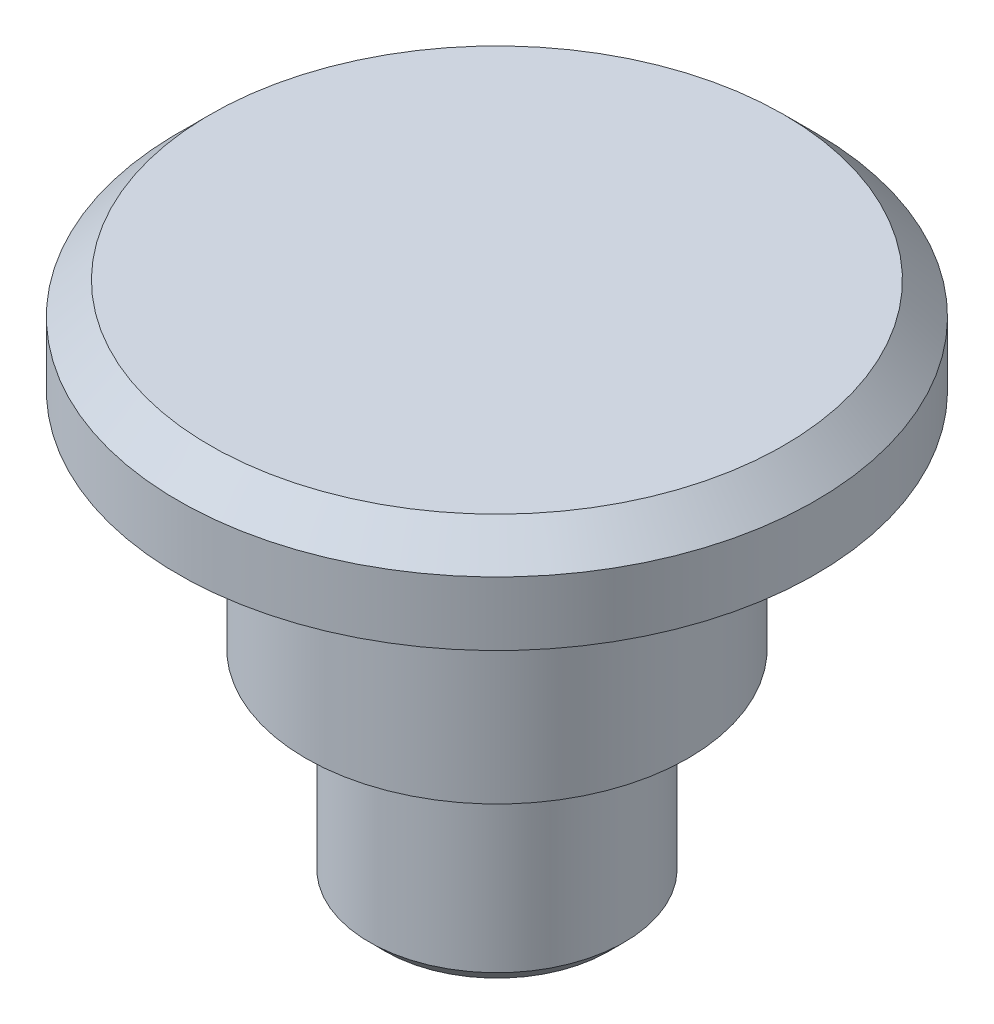
ISO-10303-21;
HEADER;
FILE_DESCRIPTION(('STEP AP214'),'2;1');
FILE_NAME('part.step','',(''),(''),'','','');
FILE_SCHEMA(('AUTOMOTIVE_DESIGN { 1 0 10303 214 1 1 1 1 }'));
ENDSEC;
DATA;
#1=APPLICATION_CONTEXT('core data for automotive mechanical design processes');
#2=APPLICATION_PROTOCOL_DEFINITION('international standard','automotive_design',2000,#1);
#3=PRODUCT_CONTEXT('',#1,'mechanical');
#4=PRODUCT('Part','Part','',(#3));
#5=PRODUCT_RELATED_PRODUCT_CATEGORY('part','',(#4));
#6=PRODUCT_DEFINITION_FORMATION('','',#4);
#7=PRODUCT_DEFINITION_CONTEXT('part definition',#1,'design');
#8=PRODUCT_DEFINITION('design','',#6,#7);
#9=PRODUCT_DEFINITION_SHAPE('','',#8);
#10=(LENGTH_UNIT() NAMED_UNIT(*) SI_UNIT(.MILLI.,.METRE.));
#11=(NAMED_UNIT(*) PLANE_ANGLE_UNIT() SI_UNIT($,.RADIAN.));
#12=(NAMED_UNIT(*) SI_UNIT($,.STERADIAN.) SOLID_ANGLE_UNIT());
#13=UNCERTAINTY_MEASURE_WITH_UNIT(LENGTH_MEASURE(1.E-05),#10,'distance_accuracy_value','');
#14=(GEOMETRIC_REPRESENTATION_CONTEXT(3) GLOBAL_UNCERTAINTY_ASSIGNED_CONTEXT((#13)) GLOBAL_UNIT_ASSIGNED_CONTEXT((#10,
#11,#12)) REPRESENTATION_CONTEXT('',''));
#15=CARTESIAN_POINT('',(0.,0.,0.));
#16=DIRECTION('',(0.,0.,1.));
#17=DIRECTION('',(1.,0.,0.));
#18=AXIS2_PLACEMENT_3D('',#15,#16,#17);
#19=CARTESIAN_POINT('',(0.,0.,0.));
#20=DIRECTION('',(0.,-1.,0.));
#21=DIRECTION('',(0.,0.,-1.));
#22=AXIS2_PLACEMENT_3D('',#19,#20,#21);
#23=PLANE('',#22);
#24=CARTESIAN_POINT('',(0.,0.,0.));
#25=DIRECTION('',(0.,-1.,0.));
#26=DIRECTION('',(0.,0.,-1.));
#27=AXIS2_PLACEMENT_3D('',#24,#25,#26);
#28=CIRCLE('',#27,3.50000000000001);
#29=CARTESIAN_POINT('',(0.,0.,-3.50000000000001));
#30=VERTEX_POINT('',#29);
#31=EDGE_CURVE('E10',#30,#30,#28,.T.);
#32=ORIENTED_EDGE('',*,*,#31,.T.);
#33=EDGE_LOOP('',(#32));
#34=FACE_BOUND('',#33,.T.);
#35=ADVANCED_FACE('F35',(#34),#23,.T.);
#36=CARTESIAN_POINT('',(0.,0.,0.));
#37=DIRECTION('',(0.,1.,0.));
#38=DIRECTION('',(0.,0.,1.));
#39=AXIS2_PLACEMENT_3D('',#36,#37,#38);
#40=CONICAL_SURFACE('',#39,3.50000000000001,0.785398163397448);
#41=CARTESIAN_POINT('',(0.,0.499999999999945,-1.11022302462516E-13));
#42=DIRECTION('',(0.,-1.,0.));
#43=DIRECTION('',(0.,0.,-1.));
#44=AXIS2_PLACEMENT_3D('',#41,#42,#43);
#45=CIRCLE('',#44,4.00000000000001);
#46=CARTESIAN_POINT('',(0.,0.499999999999945,-4.00000000000012));
#47=VERTEX_POINT('',#46);
#48=EDGE_CURVE('E42',#47,#47,#45,.T.);
#49=ORIENTED_EDGE('',*,*,#48,.T.);
#50=EDGE_LOOP('',(#49));
#51=FACE_BOUND('',#50,.T.);
#52=ORIENTED_EDGE('',*,*,#31,.F.);
#53=EDGE_LOOP('',(#52));
#54=FACE_BOUND('',#53,.T.);
#55=ADVANCED_FACE('F87',(#51,#54),#40,.T.);
#56=CARTESIAN_POINT('',(0.,0.,0.));
#57=DIRECTION('',(0.,-1.,0.));
#58=DIRECTION('',(0.,0.,-1.));
#59=AXIS2_PLACEMENT_3D('',#56,#57,#58);
#60=CYLINDRICAL_SURFACE('',#59,4.00000000000001);
#61=CARTESIAN_POINT('',(0.,6.49999999999995,1.11022302462516E-13));
#62=DIRECTION('',(0.,-1.,0.));
#63=DIRECTION('',(0.,0.,-1.));
#64=AXIS2_PLACEMENT_3D('',#61,#62,#63);
#65=CIRCLE('',#64,4.00000000000001);
#66=CARTESIAN_POINT('',(0.,6.49999999999995,-3.9999999999999));
#67=VERTEX_POINT('',#66);
#68=EDGE_CURVE('E47',#67,#67,#65,.T.);
#69=ORIENTED_EDGE('',*,*,#68,.T.);
#70=EDGE_LOOP('',(#69));
#71=FACE_BOUND('',#70,.T.);
#72=ORIENTED_EDGE('',*,*,#48,.F.);
#73=EDGE_LOOP('',(#72));
#74=FACE_BOUND('',#73,.T.);
#75=ADVANCED_FACE('F91',(#71,#74),#60,.T.);
#76=CARTESIAN_POINT('',(0.,6.49999999999995,1.11022302462516E-13));
#77=DIRECTION('',(0.,-1.,0.));
#78=DIRECTION('',(0.,0.,-1.));
#79=AXIS2_PLACEMENT_3D('',#76,#77,#78);
#80=TOROIDAL_SURFACE('',#79,4.30000000000001,0.3);
#81=CARTESIAN_POINT('',(0.,6.49999999999995,1.11022302462516E-13));
#82=DIRECTION('',(0.,-1.,0.));
#83=DIRECTION('',(0.,0.,-1.));
#84=AXIS2_PLACEMENT_3D('',#81,#82,#83);
#85=CIRCLE('',#84,4.60000000000001);
#86=CARTESIAN_POINT('',(0.,6.49999999999995,-4.5999999999999));
#87=VERTEX_POINT('',#86);
#88=EDGE_CURVE('E51',#87,#87,#85,.T.);
#89=ORIENTED_EDGE('',*,*,#88,.T.);
#90=EDGE_LOOP('',(#89));
#91=FACE_BOUND('',#90,.T.);
#92=ORIENTED_EDGE('',*,*,#68,.F.);
#93=EDGE_LOOP('',(#92));
#94=FACE_BOUND('',#93,.T.);
#95=ADVANCED_FACE('F95',(#91,#94),#80,.F.);
#96=CARTESIAN_POINT('',(5.99999999999934,6.49999999999884,-2.22044604925031E-13));
#97=DIRECTION('',(0.,-1.,0.));
#98=DIRECTION('',(0.,0.,-1.));
#99=AXIS2_PLACEMENT_3D('',#96,#97,#98);
#100=PLANE('',#99);
#101=CARTESIAN_POINT('',(0.,6.49999999999995,1.11022302462516E-13));
#102=DIRECTION('',(0.,-1.,0.));
#103=DIRECTION('',(0.,0.,-1.));
#104=AXIS2_PLACEMENT_3D('',#101,#102,#103);
#105=CIRCLE('',#104,6.00000000000001);
#106=CARTESIAN_POINT('',(0.,6.49999999999995,-5.9999999999999));
#107=VERTEX_POINT('',#106);
#108=EDGE_CURVE('E56',#107,#107,#105,.T.);
#109=ORIENTED_EDGE('',*,*,#108,.T.);
#110=EDGE_LOOP('',(#109));
#111=FACE_BOUND('',#110,.T.);
#112=ORIENTED_EDGE('',*,*,#88,.F.);
#113=EDGE_LOOP('',(#112));
#114=FACE_BOUND('',#113,.T.);
#115=ADVANCED_FACE('F102',(#111,#114),#100,.T.);
#116=CARTESIAN_POINT('',(0.,0.,0.));
#117=DIRECTION('',(0.,-1.,0.));
#118=DIRECTION('',(0.,0.,-1.));
#119=AXIS2_PLACEMENT_3D('',#116,#117,#118);
#120=CYLINDRICAL_SURFACE('',#119,6.00000000000001);
#121=CARTESIAN_POINT('',(-4.44089209850063E-13,13.5,-3.33066907387547E-13));
#122=DIRECTION('',(0.,-1.,0.));
#123=DIRECTION('',(0.,0.,-1.));
#124=AXIS2_PLACEMENT_3D('',#121,#122,#123);
#125=CIRCLE('',#124,6.00000000000001);
#126=CARTESIAN_POINT('',(-4.62407889756378E-13,13.5,-6.00000000000034));
#127=VERTEX_POINT('',#126);
#128=EDGE_CURVE('E59',#127,#127,#125,.T.);
#129=ORIENTED_EDGE('',*,*,#128,.T.);
#130=EDGE_LOOP('',(#129));
#131=FACE_BOUND('',#130,.T.);
#132=ORIENTED_EDGE('',*,*,#108,.F.);
#133=EDGE_LOOP('',(#132));
#134=FACE_BOUND('',#133,.T.);
#135=ADVANCED_FACE('F106',(#131,#134),#120,.T.);
#136=CARTESIAN_POINT('',(-4.44089209850063E-13,13.5,-3.33066907387547E-13));
#137=DIRECTION('',(0.,-1.,0.));
#138=DIRECTION('',(0.,0.,-1.));
#139=AXIS2_PLACEMENT_3D('',#136,#137,#138);
#140=TOROIDAL_SURFACE('',#139,6.30000000000001,0.3);
#141=CARTESIAN_POINT('',(-4.44089209850063E-13,13.5,-3.33066907387547E-13));
#142=DIRECTION('',(0.,-1.,0.));
#143=DIRECTION('',(0.,0.,-1.));
#144=AXIS2_PLACEMENT_3D('',#141,#142,#143);
#145=CIRCLE('',#144,6.6);
#146=CARTESIAN_POINT('',(-4.64239757747009E-13,13.5,-6.60000000000034));
#147=VERTEX_POINT('',#146);
#148=EDGE_CURVE('E62',#147,#147,#145,.T.);
#149=ORIENTED_EDGE('',*,*,#148,.T.);
#150=EDGE_LOOP('',(#149));
#151=FACE_BOUND('',#150,.T.);
#152=ORIENTED_EDGE('',*,*,#128,.F.);
#153=EDGE_LOOP('',(#152));
#154=FACE_BOUND('',#153,.T.);
#155=ADVANCED_FACE('F110',(#151,#154),#140,.F.);
#156=CARTESIAN_POINT('',(6.59999999999972,13.5,-1.11022302462516E-13));
#157=DIRECTION('',(0.,-1.,0.));
#158=DIRECTION('',(0.,0.,-1.));
#159=AXIS2_PLACEMENT_3D('',#156,#157,#158);
#160=PLANE('',#159);
#161=CARTESIAN_POINT('',(-4.44089209850063E-13,13.5,-3.33066907387547E-13));
#162=DIRECTION('',(0.,-1.,0.));
#163=DIRECTION('',(0.,0.,-1.));
#164=AXIS2_PLACEMENT_3D('',#161,#162,#163);
#165=CIRCLE('',#164,10.);
#166=CARTESIAN_POINT('',(-4.74620343027254E-13,13.5,-10.0000000000003));
#167=VERTEX_POINT('',#166);
#168=EDGE_CURVE('E65',#167,#167,#165,.T.);
#169=ORIENTED_EDGE('',*,*,#168,.T.);
#170=EDGE_LOOP('',(#169));
#171=FACE_BOUND('',#170,.T.);
#172=ORIENTED_EDGE('',*,*,#148,.F.);
#173=EDGE_LOOP('',(#172));
#174=FACE_BOUND('',#173,.T.);
#175=ADVANCED_FACE('F114',(#171,#174),#160,.T.);
#176=CARTESIAN_POINT('',(0.,0.,0.));
#177=DIRECTION('',(0.,-1.,0.));
#178=DIRECTION('',(0.,0.,-1.));
#179=AXIS2_PLACEMENT_3D('',#176,#177,#178);
#180=CYLINDRICAL_SURFACE('',#179,10.);
#181=CARTESIAN_POINT('',(0.,15.5,1.11022302462516E-13));
#182=DIRECTION('',(0.,-1.,0.));
#183=DIRECTION('',(0.,0.,-1.));
#184=AXIS2_PLACEMENT_3D('',#181,#182,#183);
#185=CIRCLE('',#184,10.);
#186=CARTESIAN_POINT('',(0.,15.5,-9.9999999999999));
#187=VERTEX_POINT('',#186);
#188=EDGE_CURVE('E68',#187,#187,#185,.T.);
#189=ORIENTED_EDGE('',*,*,#188,.T.);
#190=EDGE_LOOP('',(#189));
#191=FACE_BOUND('',#190,.T.);
#192=ORIENTED_EDGE('',*,*,#168,.F.);
#193=EDGE_LOOP('',(#192));
#194=FACE_BOUND('',#193,.T.);
#195=ADVANCED_FACE('F84',(#191,#194),#180,.T.);
#196=CARTESIAN_POINT('',(0.,15.5,1.11022302462516E-13));
#197=DIRECTION('',(0.,-1.,0.));
#198=DIRECTION('',(0.,0.,-1.));
#199=AXIS2_PLACEMENT_3D('',#196,#197,#198);
#200=CONICAL_SURFACE('',#199,10.,0.785398163397448);
#201=CARTESIAN_POINT('',(-8.88178419700125E-13,16.5,-3.33066907387547E-13));
#202=DIRECTION('',(0.,-1.,0.));
#203=DIRECTION('',(0.,0.,-1.));
#204=AXIS2_PLACEMENT_3D('',#201,#202,#203);
#205=CIRCLE('',#204,9.00000000000001);
#206=CARTESIAN_POINT('',(-9.15656439559598E-13,16.5,-9.00000000000034));
#207=VERTEX_POINT('',#206);
#208=EDGE_CURVE('E71',#207,#207,#205,.T.);
#209=ORIENTED_EDGE('',*,*,#208,.T.);
#210=EDGE_LOOP('',(#209));
#211=FACE_BOUND('',#210,.T.);
#212=ORIENTED_EDGE('',*,*,#188,.F.);
#213=EDGE_LOOP('',(#212));
#214=FACE_BOUND('',#213,.T.);
#215=ADVANCED_FACE('F75',(#211,#214),#200,.T.);
#216=CARTESIAN_POINT('',(8.9999999999999,16.5,0.));
#217=DIRECTION('',(0.,1.,0.));
#218=DIRECTION('',(0.,0.,1.));
#219=AXIS2_PLACEMENT_3D('',#216,#217,#218);
#220=PLANE('',#219);
#221=ORIENTED_EDGE('',*,*,#208,.F.);
#222=EDGE_LOOP('',(#221));
#223=FACE_BOUND('',#222,.T.);
#224=ADVANCED_FACE('F78',(#223),#220,.T.);
#225=CLOSED_SHELL('',(#35,#55,#75,#95,#115,#135,#155,#175,#195,#215,#224));
#226=MANIFOLD_SOLID_BREP('B2',#225);
#227=ADVANCED_BREP_SHAPE_REPRESENTATION('',(#18,#226),#14);
#228=SHAPE_DEFINITION_REPRESENTATION(#9,#227);
ENDSEC;
END-ISO-10303-21;
